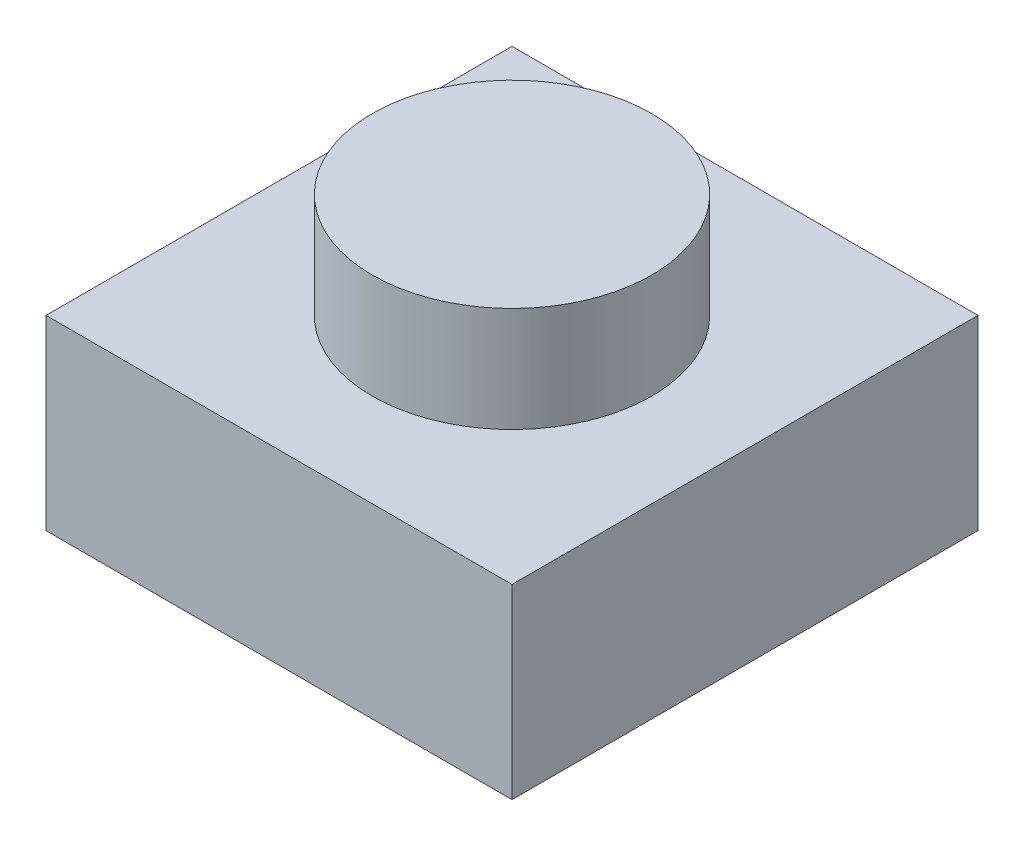
ISO-10303-21;
HEADER;
FILE_DESCRIPTION(('STEP AP214'),'2;1');
FILE_NAME('part.step','',(''),(''),'','','');
FILE_SCHEMA(('AUTOMOTIVE_DESIGN { 1 0 10303 214 1 1 1 1 }'));
ENDSEC;
DATA;
#1=APPLICATION_CONTEXT('core data for automotive mechanical design processes');
#2=APPLICATION_PROTOCOL_DEFINITION('international standard','automotive_design',2000,#1);
#3=PRODUCT_CONTEXT('',#1,'mechanical');
#4=PRODUCT('Part','Part','',(#3));
#5=PRODUCT_RELATED_PRODUCT_CATEGORY('part','',(#4));
#6=PRODUCT_DEFINITION_FORMATION('','',#4);
#7=PRODUCT_DEFINITION_CONTEXT('part definition',#1,'design');
#8=PRODUCT_DEFINITION('design','',#6,#7);
#9=PRODUCT_DEFINITION_SHAPE('','',#8);
#10=(LENGTH_UNIT() NAMED_UNIT(*) SI_UNIT(.MILLI.,.METRE.));
#11=(NAMED_UNIT(*) PLANE_ANGLE_UNIT() SI_UNIT($,.RADIAN.));
#12=(NAMED_UNIT(*) SI_UNIT($,.STERADIAN.) SOLID_ANGLE_UNIT());
#13=UNCERTAINTY_MEASURE_WITH_UNIT(LENGTH_MEASURE(1.E-05),#10,'distance_accuracy_value','');
#14=(GEOMETRIC_REPRESENTATION_CONTEXT(3) GLOBAL_UNCERTAINTY_ASSIGNED_CONTEXT((#13)) GLOBAL_UNIT_ASSIGNED_CONTEXT((#10,
#11,#12)) REPRESENTATION_CONTEXT('',''));
#15=CARTESIAN_POINT('',(0.,0.,0.));
#16=DIRECTION('',(0.,0.,1.));
#17=DIRECTION('',(1.,0.,0.));
#18=AXIS2_PLACEMENT_3D('',#15,#16,#17);
#19=CARTESIAN_POINT('',(0.,3.2,0.));
#20=DIRECTION('',(1.,0.,0.));
#21=DIRECTION('',(0.,0.,-1.));
#22=AXIS2_PLACEMENT_3D('',#19,#20,#21);
#23=PLANE('',#22);
#24=DIRECTION('',(0.,0.,1.));
#25=VECTOR('',#24,1.);
#26=CARTESIAN_POINT('',(0.,0.,0.));
#27=LINE('',#26,#25);
#28=CARTESIAN_POINT('',(0.,0.,-8.));
#29=VERTEX_POINT('',#28);
#30=CARTESIAN_POINT('',(0.,0.,0.));
#31=VERTEX_POINT('',#30);
#32=EDGE_CURVE('E171',#29,#31,#27,.T.);
#33=ORIENTED_EDGE('',*,*,#32,.T.);
#34=DIRECTION('',(0.,-1.,0.));
#35=VECTOR('',#34,1.);
#36=CARTESIAN_POINT('',(0.,3.2,0.));
#37=LINE('',#36,#35);
#38=CARTESIAN_POINT('',(0.,3.2,0.));
#39=VERTEX_POINT('',#38);
#40=EDGE_CURVE('E45',#39,#31,#37,.T.);
#41=ORIENTED_EDGE('',*,*,#40,.F.);
#42=DIRECTION('',(0.,0.,1.));
#43=VECTOR('',#42,1.);
#44=CARTESIAN_POINT('',(0.,3.2,0.));
#45=LINE('',#44,#43);
#46=CARTESIAN_POINT('',(0.,3.2,-8.));
#47=VERTEX_POINT('',#46);
#48=EDGE_CURVE('E173',#47,#39,#45,.T.);
#49=ORIENTED_EDGE('',*,*,#48,.F.);
#50=DIRECTION('',(0.,-1.,0.));
#51=VECTOR('',#50,1.);
#52=CARTESIAN_POINT('',(0.,3.2,-8.));
#53=LINE('',#52,#51);
#54=EDGE_CURVE('E183',#47,#29,#53,.T.);
#55=ORIENTED_EDGE('',*,*,#54,.T.);
#56=EDGE_LOOP('',(#33,#41,#49,#55));
#57=FACE_BOUND('',#56,.T.);
#58=ADVANCED_FACE('F42',(#57),#23,.F.);
#59=CARTESIAN_POINT('',(0.,3.2,0.));
#60=DIRECTION('',(0.,0.,-1.));
#61=DIRECTION('',(-1.,0.,0.));
#62=AXIS2_PLACEMENT_3D('',#59,#60,#61);
#63=PLANE('',#62);
#64=DIRECTION('',(1.,0.,0.));
#65=VECTOR('',#64,1.);
#66=CARTESIAN_POINT('',(0.,0.,0.));
#67=LINE('',#66,#65);
#68=CARTESIAN_POINT('',(8.,0.,0.));
#69=VERTEX_POINT('',#68);
#70=EDGE_CURVE('E187',#31,#69,#67,.T.);
#71=ORIENTED_EDGE('',*,*,#70,.T.);
#72=DIRECTION('',(0.,-1.,0.));
#73=VECTOR('',#72,1.);
#74=CARTESIAN_POINT('',(8.,3.2,0.));
#75=LINE('',#74,#73);
#76=CARTESIAN_POINT('',(8.,3.2,0.));
#77=VERTEX_POINT('',#76);
#78=EDGE_CURVE('E199',#77,#69,#75,.T.);
#79=ORIENTED_EDGE('',*,*,#78,.F.);
#80=DIRECTION('',(1.,0.,0.));
#81=VECTOR('',#80,1.);
#82=CARTESIAN_POINT('',(0.,3.2,0.));
#83=LINE('',#82,#81);
#84=EDGE_CURVE('E96',#39,#77,#83,.T.);
#85=ORIENTED_EDGE('',*,*,#84,.F.);
#86=ORIENTED_EDGE('',*,*,#40,.T.);
#87=EDGE_LOOP('',(#71,#79,#85,#86));
#88=FACE_BOUND('',#87,.T.);
#89=ADVANCED_FACE('F207',(#88),#63,.F.);
#90=CARTESIAN_POINT('',(8.,3.2,0.));
#91=DIRECTION('',(-1.,0.,0.));
#92=DIRECTION('',(0.,0.,1.));
#93=AXIS2_PLACEMENT_3D('',#90,#91,#92);
#94=PLANE('',#93);
#95=DIRECTION('',(0.,0.,-1.));
#96=VECTOR('',#95,1.);
#97=CARTESIAN_POINT('',(8.,0.,0.));
#98=LINE('',#97,#96);
#99=CARTESIAN_POINT('',(8.,0.,-8.));
#100=VERTEX_POINT('',#99);
#101=EDGE_CURVE('E190',#69,#100,#98,.T.);
#102=ORIENTED_EDGE('',*,*,#101,.T.);
#103=DIRECTION('',(0.,-1.,0.));
#104=VECTOR('',#103,1.);
#105=CARTESIAN_POINT('',(8.,3.2,-8.));
#106=LINE('',#105,#104);
#107=CARTESIAN_POINT('',(8.,3.2,-8.));
#108=VERTEX_POINT('',#107);
#109=EDGE_CURVE('E197',#108,#100,#106,.T.);
#110=ORIENTED_EDGE('',*,*,#109,.F.);
#111=DIRECTION('',(0.,0.,-1.));
#112=VECTOR('',#111,1.);
#113=CARTESIAN_POINT('',(8.,3.2,0.));
#114=LINE('',#113,#112);
#115=EDGE_CURVE('E178',#77,#108,#114,.T.);
#116=ORIENTED_EDGE('',*,*,#115,.F.);
#117=ORIENTED_EDGE('',*,*,#78,.T.);
#118=EDGE_LOOP('',(#102,#110,#116,#117));
#119=FACE_BOUND('',#118,.T.);
#120=ADVANCED_FACE('F214',(#119),#94,.F.);
#121=CARTESIAN_POINT('',(0.,3.2,-8.));
#122=DIRECTION('',(0.,0.,1.));
#123=DIRECTION('',(1.,0.,0.));
#124=AXIS2_PLACEMENT_3D('',#121,#122,#123);
#125=PLANE('',#124);
#126=DIRECTION('',(-1.,0.,0.));
#127=VECTOR('',#126,1.);
#128=CARTESIAN_POINT('',(0.,0.,-8.));
#129=LINE('',#128,#127);
#130=EDGE_CURVE('E88',#100,#29,#129,.T.);
#131=ORIENTED_EDGE('',*,*,#130,.T.);
#132=ORIENTED_EDGE('',*,*,#54,.F.);
#133=DIRECTION('',(-1.,0.,0.));
#134=VECTOR('',#133,1.);
#135=CARTESIAN_POINT('',(0.,3.2,-8.));
#136=LINE('',#135,#134);
#137=EDGE_CURVE('E67',#108,#47,#136,.T.);
#138=ORIENTED_EDGE('',*,*,#137,.F.);
#139=ORIENTED_EDGE('',*,*,#109,.T.);
#140=EDGE_LOOP('',(#131,#132,#138,#139));
#141=FACE_BOUND('',#140,.T.);
#142=ADVANCED_FACE('F215',(#141),#125,.F.);
#143=CARTESIAN_POINT('',(0.,3.2,0.));
#144=DIRECTION('',(0.,-1.,0.));
#145=DIRECTION('',(0.,0.,-1.));
#146=AXIS2_PLACEMENT_3D('',#143,#144,#145);
#147=PLANE('',#146);
#148=CARTESIAN_POINT('',(4.,3.2,-4.));
#149=DIRECTION('',(0.,1.,0.));
#150=DIRECTION('',(0.,0.,1.));
#151=AXIS2_PLACEMENT_3D('',#148,#149,#150);
#152=CIRCLE('',#151,2.4);
#153=CARTESIAN_POINT('',(4.,3.2,-1.6));
#154=VERTEX_POINT('',#153);
#155=EDGE_CURVE('E11',#154,#154,#152,.T.);
#156=ORIENTED_EDGE('',*,*,#155,.F.);
#157=EDGE_LOOP('',(#156));
#158=FACE_BOUND('',#157,.T.);
#159=ORIENTED_EDGE('',*,*,#48,.T.);
#160=ORIENTED_EDGE('',*,*,#84,.T.);
#161=ORIENTED_EDGE('',*,*,#115,.T.);
#162=ORIENTED_EDGE('',*,*,#137,.T.);
#163=EDGE_LOOP('',(#159,#160,#161,#162));
#164=FACE_BOUND('',#163,.T.);
#165=ADVANCED_FACE('F216',(#158,#164),#147,.F.);
#166=CARTESIAN_POINT('',(0.,0.,0.));
#167=DIRECTION('',(0.,-1.,0.));
#168=DIRECTION('',(0.,0.,-1.));
#169=AXIS2_PLACEMENT_3D('',#166,#167,#168);
#170=PLANE('',#169);
#171=DIRECTION('',(0.,0.,-1.));
#172=VECTOR('',#171,1.);
#173=CARTESIAN_POINT('',(1.6,0.,-1.6));
#174=LINE('',#173,#172);
#175=CARTESIAN_POINT('',(1.6,0.,-1.6));
#176=VERTEX_POINT('',#175);
#177=CARTESIAN_POINT('',(1.6,0.,-6.4));
#178=VERTEX_POINT('',#177);
#179=EDGE_CURVE('E58',#176,#178,#174,.T.);
#180=ORIENTED_EDGE('',*,*,#179,.F.);
#181=DIRECTION('',(-1.,0.,0.));
#182=VECTOR('',#181,1.);
#183=CARTESIAN_POINT('',(1.6,0.,-1.6));
#184=LINE('',#183,#182);
#185=CARTESIAN_POINT('',(6.4,0.,-1.6));
#186=VERTEX_POINT('',#185);
#187=EDGE_CURVE('E141',#186,#176,#184,.T.);
#188=ORIENTED_EDGE('',*,*,#187,.F.);
#189=DIRECTION('',(0.,0.,1.));
#190=VECTOR('',#189,1.);
#191=CARTESIAN_POINT('',(6.4,0.,-1.6));
#192=LINE('',#191,#190);
#193=CARTESIAN_POINT('',(6.4,0.,-6.4));
#194=VERTEX_POINT('',#193);
#195=EDGE_CURVE('E145',#194,#186,#192,.T.);
#196=ORIENTED_EDGE('',*,*,#195,.F.);
#197=DIRECTION('',(1.,0.,0.));
#198=VECTOR('',#197,1.);
#199=CARTESIAN_POINT('',(1.6,0.,-6.4));
#200=LINE('',#199,#198);
#201=EDGE_CURVE('E154',#178,#194,#200,.T.);
#202=ORIENTED_EDGE('',*,*,#201,.F.);
#203=EDGE_LOOP('',(#180,#188,#196,#202));
#204=FACE_BOUND('',#203,.T.);
#205=ORIENTED_EDGE('',*,*,#32,.F.);
#206=ORIENTED_EDGE('',*,*,#130,.F.);
#207=ORIENTED_EDGE('',*,*,#101,.F.);
#208=ORIENTED_EDGE('',*,*,#70,.F.);
#209=EDGE_LOOP('',(#205,#206,#207,#208));
#210=FACE_BOUND('',#209,.T.);
#211=ADVANCED_FACE('F212',(#204,#210),#170,.T.);
#212=CARTESIAN_POINT('',(4.,5.,-4.));
#213=DIRECTION('',(0.,-1.,0.));
#214=DIRECTION('',(0.,0.,-1.));
#215=AXIS2_PLACEMENT_3D('',#212,#213,#214);
#216=CYLINDRICAL_SURFACE('',#215,2.4);
#217=CARTESIAN_POINT('',(4.,5.,-4.));
#218=DIRECTION('',(0.,1.,0.));
#219=DIRECTION('',(0.,0.,1.));
#220=AXIS2_PLACEMENT_3D('',#217,#218,#219);
#221=CIRCLE('',#220,2.4);
#222=CARTESIAN_POINT('',(4.,5.,-1.6));
#223=VERTEX_POINT('',#222);
#224=EDGE_CURVE('E163',#223,#223,#221,.T.);
#225=ORIENTED_EDGE('',*,*,#224,.F.);
#226=EDGE_LOOP('',(#225));
#227=FACE_BOUND('',#226,.T.);
#228=ORIENTED_EDGE('',*,*,#155,.T.);
#229=EDGE_LOOP('',(#228));
#230=FACE_BOUND('',#229,.T.);
#231=ADVANCED_FACE('F224',(#227,#230),#216,.T.);
#232=CARTESIAN_POINT('',(4.,5.,-4.));
#233=DIRECTION('',(0.,1.,0.));
#234=DIRECTION('',(0.,0.,1.));
#235=AXIS2_PLACEMENT_3D('',#232,#233,#234);
#236=PLANE('',#235);
#237=ORIENTED_EDGE('',*,*,#224,.T.);
#238=EDGE_LOOP('',(#237));
#239=FACE_BOUND('',#238,.T.);
#240=ADVANCED_FACE('F260',(#239),#236,.T.);
#241=CARTESIAN_POINT('',(1.6,1.8,-1.6));
#242=DIRECTION('',(-1.,0.,0.));
#243=DIRECTION('',(0.,0.,1.));
#244=AXIS2_PLACEMENT_3D('',#241,#242,#243);
#245=PLANE('',#244);
#246=ORIENTED_EDGE('',*,*,#179,.T.);
#247=DIRECTION('',(0.,-1.,0.));
#248=VECTOR('',#247,1.);
#249=CARTESIAN_POINT('',(1.6,1.8,-6.4));
#250=LINE('',#249,#248);
#251=CARTESIAN_POINT('',(1.6,1.8,-6.4));
#252=VERTEX_POINT('',#251);
#253=EDGE_CURVE('E116',#252,#178,#250,.T.);
#254=ORIENTED_EDGE('',*,*,#253,.F.);
#255=DIRECTION('',(0.,0.,-1.));
#256=VECTOR('',#255,1.);
#257=CARTESIAN_POINT('',(1.6,1.8,-1.6));
#258=LINE('',#257,#256);
#259=CARTESIAN_POINT('',(1.6,1.8,-1.6));
#260=VERTEX_POINT('',#259);
#261=EDGE_CURVE('E120',#260,#252,#258,.T.);
#262=ORIENTED_EDGE('',*,*,#261,.F.);
#263=DIRECTION('',(0.,-1.,0.));
#264=VECTOR('',#263,1.);
#265=CARTESIAN_POINT('',(1.6,1.8,-1.6));
#266=LINE('',#265,#264);
#267=EDGE_CURVE('E160',#260,#176,#266,.T.);
#268=ORIENTED_EDGE('',*,*,#267,.T.);
#269=EDGE_LOOP('',(#246,#254,#262,#268));
#270=FACE_BOUND('',#269,.T.);
#271=ADVANCED_FACE('F118',(#270),#245,.F.);
#272=CARTESIAN_POINT('',(1.6,1.8,-1.6));
#273=DIRECTION('',(0.,0.,1.));
#274=DIRECTION('',(1.,0.,0.));
#275=AXIS2_PLACEMENT_3D('',#272,#273,#274);
#276=PLANE('',#275);
#277=ORIENTED_EDGE('',*,*,#187,.T.);
#278=ORIENTED_EDGE('',*,*,#267,.F.);
#279=DIRECTION('',(-1.,0.,0.));
#280=VECTOR('',#279,1.);
#281=CARTESIAN_POINT('',(1.6,1.8,-1.6));
#282=LINE('',#281,#280);
#283=CARTESIAN_POINT('',(6.4,1.8,-1.6));
#284=VERTEX_POINT('',#283);
#285=EDGE_CURVE('E127',#284,#260,#282,.T.);
#286=ORIENTED_EDGE('',*,*,#285,.F.);
#287=DIRECTION('',(0.,-1.,0.));
#288=VECTOR('',#287,1.);
#289=CARTESIAN_POINT('',(6.4,1.8,-1.6));
#290=LINE('',#289,#288);
#291=EDGE_CURVE('E164',#284,#186,#290,.T.);
#292=ORIENTED_EDGE('',*,*,#291,.T.);
#293=EDGE_LOOP('',(#277,#278,#286,#292));
#294=FACE_BOUND('',#293,.T.);
#295=ADVANCED_FACE('F286',(#294),#276,.F.);
#296=CARTESIAN_POINT('',(6.4,1.8,-1.6));
#297=DIRECTION('',(1.,0.,0.));
#298=DIRECTION('',(0.,0.,-1.));
#299=AXIS2_PLACEMENT_3D('',#296,#297,#298);
#300=PLANE('',#299);
#301=ORIENTED_EDGE('',*,*,#195,.T.);
#302=ORIENTED_EDGE('',*,*,#291,.F.);
#303=DIRECTION('',(0.,0.,1.));
#304=VECTOR('',#303,1.);
#305=CARTESIAN_POINT('',(6.4,1.8,-1.6));
#306=LINE('',#305,#304);
#307=CARTESIAN_POINT('',(6.4,1.8,-6.4));
#308=VERTEX_POINT('',#307);
#309=EDGE_CURVE('E136',#308,#284,#306,.T.);
#310=ORIENTED_EDGE('',*,*,#309,.F.);
#311=DIRECTION('',(0.,-1.,0.));
#312=VECTOR('',#311,1.);
#313=CARTESIAN_POINT('',(6.4,1.8,-6.4));
#314=LINE('',#313,#312);
#315=EDGE_CURVE('E126',#308,#194,#314,.T.);
#316=ORIENTED_EDGE('',*,*,#315,.T.);
#317=EDGE_LOOP('',(#301,#302,#310,#316));
#318=FACE_BOUND('',#317,.T.);
#319=ADVANCED_FACE('F296',(#318),#300,.F.);
#320=CARTESIAN_POINT('',(1.6,1.8,-6.4));
#321=DIRECTION('',(0.,0.,-1.));
#322=DIRECTION('',(-1.,0.,0.));
#323=AXIS2_PLACEMENT_3D('',#320,#321,#322);
#324=PLANE('',#323);
#325=ORIENTED_EDGE('',*,*,#201,.T.);
#326=ORIENTED_EDGE('',*,*,#315,.F.);
#327=DIRECTION('',(1.,0.,0.));
#328=VECTOR('',#327,1.);
#329=CARTESIAN_POINT('',(1.6,1.8,-6.4));
#330=LINE('',#329,#328);
#331=EDGE_CURVE('E130',#252,#308,#330,.T.);
#332=ORIENTED_EDGE('',*,*,#331,.F.);
#333=ORIENTED_EDGE('',*,*,#253,.T.);
#334=EDGE_LOOP('',(#325,#326,#332,#333));
#335=FACE_BOUND('',#334,.T.);
#336=ADVANCED_FACE('F131',(#335),#324,.F.);
#337=CARTESIAN_POINT('',(0.,1.8,0.));
#338=DIRECTION('',(0.,-1.,0.));
#339=DIRECTION('',(0.,0.,-1.));
#340=AXIS2_PLACEMENT_3D('',#337,#338,#339);
#341=PLANE('',#340);
#342=ORIENTED_EDGE('',*,*,#261,.T.);
#343=ORIENTED_EDGE('',*,*,#331,.T.);
#344=ORIENTED_EDGE('',*,*,#309,.T.);
#345=ORIENTED_EDGE('',*,*,#285,.T.);
#346=EDGE_LOOP('',(#342,#343,#344,#345));
#347=FACE_BOUND('',#346,.T.);
#348=ADVANCED_FACE('F138',(#347),#341,.T.);
#349=CLOSED_SHELL('',(#58,#89,#120,#142,#165,#211,#231,#240,#271,#295,#319,#336,#348));
#350=MANIFOLD_SOLID_BREP('B2',#349);
#351=ADVANCED_BREP_SHAPE_REPRESENTATION('',(#18,#350),#14);
#352=SHAPE_DEFINITION_REPRESENTATION(#9,#351);
ENDSEC;
END-ISO-10303-21;
